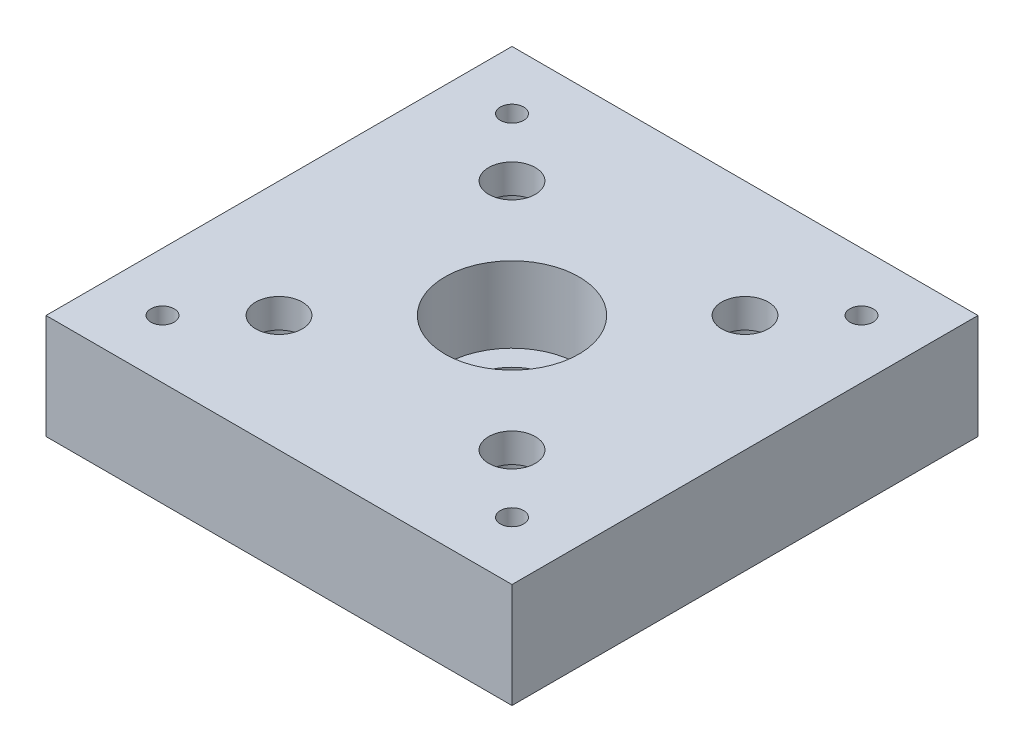
ISO-10303-21;
HEADER;
FILE_DESCRIPTION(('STEP AP214'),'2;1');
FILE_NAME('part.step','',(''),(''),'','','');
FILE_SCHEMA(('AUTOMOTIVE_DESIGN { 1 0 10303 214 1 1 1 1 }'));
ENDSEC;
DATA;
#1=APPLICATION_CONTEXT('core data for automotive mechanical design processes');
#2=APPLICATION_PROTOCOL_DEFINITION('international standard','automotive_design',2000,#1);
#3=PRODUCT_CONTEXT('',#1,'mechanical');
#4=PRODUCT('Part','Part','',(#3));
#5=PRODUCT_RELATED_PRODUCT_CATEGORY('part','',(#4));
#6=PRODUCT_DEFINITION_FORMATION('','',#4);
#7=PRODUCT_DEFINITION_CONTEXT('part definition',#1,'design');
#8=PRODUCT_DEFINITION('design','',#6,#7);
#9=PRODUCT_DEFINITION_SHAPE('','',#8);
#10=(LENGTH_UNIT() NAMED_UNIT(*) SI_UNIT(.MILLI.,.METRE.));
#11=(NAMED_UNIT(*) PLANE_ANGLE_UNIT() SI_UNIT($,.RADIAN.));
#12=(NAMED_UNIT(*) SI_UNIT($,.STERADIAN.) SOLID_ANGLE_UNIT());
#13=UNCERTAINTY_MEASURE_WITH_UNIT(LENGTH_MEASURE(1.E-05),#10,'distance_accuracy_value','');
#14=(GEOMETRIC_REPRESENTATION_CONTEXT(3) GLOBAL_UNCERTAINTY_ASSIGNED_CONTEXT((#13)) GLOBAL_UNIT_ASSIGNED_CONTEXT((#10,
#11,#12)) REPRESENTATION_CONTEXT('',''));
#15=CARTESIAN_POINT('',(0.,0.,0.));
#16=DIRECTION('',(0.,0.,1.));
#17=DIRECTION('',(1.,0.,0.));
#18=AXIS2_PLACEMENT_3D('',#15,#16,#17);
#19=CARTESIAN_POINT('',(0.,3.6,0.));
#20=DIRECTION('',(0.,-1.,0.));
#21=DIRECTION('',(0.,0.,-1.));
#22=AXIS2_PLACEMENT_3D('',#19,#20,#21);
#23=CYLINDRICAL_SURFACE('',#22,1.5);
#24=CARTESIAN_POINT('',(0.,0.,0.));
#25=DIRECTION('',(0.,1.,0.));
#26=DIRECTION('',(0.,0.,1.));
#27=AXIS2_PLACEMENT_3D('',#24,#25,#26);
#28=CIRCLE('',#27,1.5);
#29=CARTESIAN_POINT('',(0.,0.,1.5));
#30=VERTEX_POINT('',#29);
#31=EDGE_CURVE('E242',#30,#30,#28,.T.);
#32=ORIENTED_EDGE('',*,*,#31,.F.);
#33=EDGE_LOOP('',(#32));
#34=FACE_BOUND('',#33,.T.);
#35=CARTESIAN_POINT('',(0.,1.,0.));
#36=DIRECTION('',(0.,1.,0.));
#37=DIRECTION('',(0.,0.,1.));
#38=AXIS2_PLACEMENT_3D('',#35,#36,#37);
#39=CIRCLE('',#38,1.5);
#40=CARTESIAN_POINT('',(0.,1.,1.5));
#41=VERTEX_POINT('',#40);
#42=EDGE_CURVE('E251',#41,#41,#39,.T.);
#43=ORIENTED_EDGE('',*,*,#42,.T.);
#44=EDGE_LOOP('',(#43));
#45=FACE_BOUND('',#44,.T.);
#46=ADVANCED_FACE('F172',(#34,#45),#23,.F.);
#47=CARTESIAN_POINT('',(0.,3.6,0.));
#48=DIRECTION('',(0.,1.,0.));
#49=DIRECTION('',(0.,0.,1.));
#50=AXIS2_PLACEMENT_3D('',#47,#48,#49);
#51=PLANE('',#50);
#52=CARTESIAN_POINT('',(0.,3.6,0.));
#53=DIRECTION('',(0.,1.,0.));
#54=DIRECTION('',(0.,0.,1.));
#55=AXIS2_PLACEMENT_3D('',#52,#53,#54);
#56=CIRCLE('',#55,2.3);
#57=CARTESIAN_POINT('',(0.,3.6,2.3));
#58=VERTEX_POINT('',#57);
#59=EDGE_CURVE('E267',#58,#58,#56,.T.);
#60=ORIENTED_EDGE('',*,*,#59,.F.);
#61=EDGE_LOOP('',(#60));
#62=FACE_BOUND('',#61,.T.);
#63=CARTESIAN_POINT('',(-5.99999999999999,3.6,5.99999999999999));
#64=DIRECTION('',(0.,1.,0.));
#65=DIRECTION('',(0.,0.,1.));
#66=AXIS2_PLACEMENT_3D('',#63,#64,#65);
#67=CIRCLE('',#66,0.4);
#68=CARTESIAN_POINT('',(-5.99999999999999,3.6,6.4));
#69=VERTEX_POINT('',#68);
#70=EDGE_CURVE('E285',#69,#69,#67,.T.);
#71=ORIENTED_EDGE('',*,*,#70,.F.);
#72=EDGE_LOOP('',(#71));
#73=FACE_BOUND('',#72,.T.);
#74=CARTESIAN_POINT('',(-5.99999999999999,3.6,-6.00000000000001));
#75=DIRECTION('',(0.,1.,0.));
#76=DIRECTION('',(0.,0.,1.));
#77=AXIS2_PLACEMENT_3D('',#74,#75,#76);
#78=CIRCLE('',#77,0.4);
#79=CARTESIAN_POINT('',(-5.99999999999999,3.6,-5.6));
#80=VERTEX_POINT('',#79);
#81=EDGE_CURVE('E297',#80,#80,#78,.T.);
#82=ORIENTED_EDGE('',*,*,#81,.F.);
#83=EDGE_LOOP('',(#82));
#84=FACE_BOUND('',#83,.T.);
#85=CARTESIAN_POINT('',(4.,3.6,4.));
#86=DIRECTION('',(0.,1.,0.));
#87=DIRECTION('',(0.,0.,1.));
#88=AXIS2_PLACEMENT_3D('',#85,#86,#87);
#89=CIRCLE('',#88,0.8);
#90=CARTESIAN_POINT('',(4.,3.6,4.8));
#91=VERTEX_POINT('',#90);
#92=EDGE_CURVE('E305',#91,#91,#89,.T.);
#93=ORIENTED_EDGE('',*,*,#92,.F.);
#94=EDGE_LOOP('',(#93));
#95=FACE_BOUND('',#94,.T.);
#96=CARTESIAN_POINT('',(-4.,3.6,-4.));
#97=DIRECTION('',(0.,1.,0.));
#98=DIRECTION('',(0.,0.,1.));
#99=AXIS2_PLACEMENT_3D('',#96,#97,#98);
#100=CIRCLE('',#99,0.8);
#101=CARTESIAN_POINT('',(-4.,3.6,-3.2));
#102=VERTEX_POINT('',#101);
#103=EDGE_CURVE('E311',#102,#102,#100,.T.);
#104=ORIENTED_EDGE('',*,*,#103,.F.);
#105=EDGE_LOOP('',(#104));
#106=FACE_BOUND('',#105,.T.);
#107=DIRECTION('',(1.,0.,0.));
#108=VECTOR('',#107,1.);
#109=CARTESIAN_POINT('',(-7.99999999999999,3.6,7.99999999999999));
#110=LINE('',#109,#108);
#111=CARTESIAN_POINT('',(-7.99999999999999,3.6,7.99999999999999));
#112=VERTEX_POINT('',#111);
#113=CARTESIAN_POINT('',(8.00000000000001,3.6,7.99999999999999));
#114=VERTEX_POINT('',#113);
#115=EDGE_CURVE('E225',#112,#114,#110,.T.);
#116=ORIENTED_EDGE('',*,*,#115,.T.);
#117=DIRECTION('',(0.,0.,-1.));
#118=VECTOR('',#117,1.);
#119=CARTESIAN_POINT('',(8.00000000000001,3.6,7.99999999999999));
#120=LINE('',#119,#118);
#121=CARTESIAN_POINT('',(8.00000000000001,3.6,-8.00000000000001));
#122=VERTEX_POINT('',#121);
#123=EDGE_CURVE('E216',#114,#122,#120,.T.);
#124=ORIENTED_EDGE('',*,*,#123,.T.);
#125=DIRECTION('',(1.,0.,0.));
#126=VECTOR('',#125,1.);
#127=CARTESIAN_POINT('',(-7.99999999999999,3.6,-8.00000000000001));
#128=LINE('',#127,#126);
#129=CARTESIAN_POINT('',(-7.99999999999999,3.6,-8.00000000000001));
#130=VERTEX_POINT('',#129);
#131=EDGE_CURVE('E224',#130,#122,#128,.T.);
#132=ORIENTED_EDGE('',*,*,#131,.F.);
#133=DIRECTION('',(0.,0.,-1.));
#134=VECTOR('',#133,1.);
#135=CARTESIAN_POINT('',(-7.99999999999999,3.6,7.99999999999999));
#136=LINE('',#135,#134);
#137=EDGE_CURVE('E235',#112,#130,#136,.T.);
#138=ORIENTED_EDGE('',*,*,#137,.F.);
#139=EDGE_LOOP('',(#116,#124,#132,#138));
#140=FACE_BOUND('',#139,.T.);
#141=CARTESIAN_POINT('',(-4.,3.6,4.));
#142=DIRECTION('',(0.,1.,0.));
#143=DIRECTION('',(0.,0.,1.));
#144=AXIS2_PLACEMENT_3D('',#141,#142,#143);
#145=CIRCLE('',#144,0.8);
#146=CARTESIAN_POINT('',(-4.,3.6,4.8));
#147=VERTEX_POINT('',#146);
#148=EDGE_CURVE('E308',#147,#147,#145,.T.);
#149=ORIENTED_EDGE('',*,*,#148,.F.);
#150=EDGE_LOOP('',(#149));
#151=FACE_BOUND('',#150,.T.);
#152=CARTESIAN_POINT('',(4.,3.6,-4.));
#153=DIRECTION('',(0.,1.,0.));
#154=DIRECTION('',(0.,0.,1.));
#155=AXIS2_PLACEMENT_3D('',#152,#153,#154);
#156=CIRCLE('',#155,0.800000000000001);
#157=CARTESIAN_POINT('',(4.,3.6,-3.2));
#158=VERTEX_POINT('',#157);
#159=EDGE_CURVE('E300',#158,#158,#156,.T.);
#160=ORIENTED_EDGE('',*,*,#159,.F.);
#161=EDGE_LOOP('',(#160));
#162=FACE_BOUND('',#161,.T.);
#163=CARTESIAN_POINT('',(6.00000000000001,3.6,-6.00000000000001));
#164=DIRECTION('',(0.,1.,0.));
#165=DIRECTION('',(0.,0.,1.));
#166=AXIS2_PLACEMENT_3D('',#163,#164,#165);
#167=CIRCLE('',#166,0.4);
#168=CARTESIAN_POINT('',(6.00000000000001,3.6,-5.6));
#169=VERTEX_POINT('',#168);
#170=EDGE_CURVE('E291',#169,#169,#167,.T.);
#171=ORIENTED_EDGE('',*,*,#170,.F.);
#172=EDGE_LOOP('',(#171));
#173=FACE_BOUND('',#172,.T.);
#174=CARTESIAN_POINT('',(6.00000000000001,3.6,5.99999999999999));
#175=DIRECTION('',(0.,1.,0.));
#176=DIRECTION('',(0.,0.,1.));
#177=AXIS2_PLACEMENT_3D('',#174,#175,#176);
#178=CIRCLE('',#177,0.4);
#179=CARTESIAN_POINT('',(6.00000000000001,3.6,6.4));
#180=VERTEX_POINT('',#179);
#181=EDGE_CURVE('E279',#180,#180,#178,.T.);
#182=ORIENTED_EDGE('',*,*,#181,.F.);
#183=EDGE_LOOP('',(#182));
#184=FACE_BOUND('',#183,.T.);
#185=ADVANCED_FACE('F220',(#62,#73,#84,#95,#106,#140,#151,#162,#173,#184),#51,.T.);
#186=CARTESIAN_POINT('',(0.,0.,0.));
#187=DIRECTION('',(0.,1.,0.));
#188=DIRECTION('',(0.,0.,1.));
#189=AXIS2_PLACEMENT_3D('',#186,#187,#188);
#190=PLANE('',#189);
#191=CARTESIAN_POINT('',(4.,0.,-4.));
#192=DIRECTION('',(0.,1.,0.));
#193=DIRECTION('',(0.,0.,1.));
#194=AXIS2_PLACEMENT_3D('',#191,#192,#193);
#195=CIRCLE('',#194,1.);
#196=CARTESIAN_POINT('',(4.,0.,-3.));
#197=VERTEX_POINT('',#196);
#198=EDGE_CURVE('E561',#197,#197,#195,.T.);
#199=ORIENTED_EDGE('',*,*,#198,.T.);
#200=EDGE_LOOP('',(#199));
#201=FACE_BOUND('',#200,.T.);
#202=CARTESIAN_POINT('',(-4.,0.,4.));
#203=DIRECTION('',(0.,1.,0.));
#204=DIRECTION('',(0.,0.,1.));
#205=AXIS2_PLACEMENT_3D('',#202,#203,#204);
#206=CIRCLE('',#205,1.);
#207=CARTESIAN_POINT('',(-4.,0.,5.));
#208=VERTEX_POINT('',#207);
#209=EDGE_CURVE('E562',#208,#208,#206,.T.);
#210=ORIENTED_EDGE('',*,*,#209,.T.);
#211=EDGE_LOOP('',(#210));
#212=FACE_BOUND('',#211,.T.);
#213=CARTESIAN_POINT('',(-4.,0.,-4.));
#214=DIRECTION('',(0.,1.,0.));
#215=DIRECTION('',(0.,0.,1.));
#216=AXIS2_PLACEMENT_3D('',#213,#214,#215);
#217=CIRCLE('',#216,1.);
#218=CARTESIAN_POINT('',(-4.,0.,-3.));
#219=VERTEX_POINT('',#218);
#220=EDGE_CURVE('E552',#219,#219,#217,.T.);
#221=ORIENTED_EDGE('',*,*,#220,.T.);
#222=EDGE_LOOP('',(#221));
#223=FACE_BOUND('',#222,.T.);
#224=CARTESIAN_POINT('',(4.,0.,4.));
#225=DIRECTION('',(0.,1.,0.));
#226=DIRECTION('',(0.,0.,1.));
#227=AXIS2_PLACEMENT_3D('',#224,#225,#226);
#228=CIRCLE('',#227,1.);
#229=CARTESIAN_POINT('',(4.,0.,5.));
#230=VERTEX_POINT('',#229);
#231=EDGE_CURVE('E565',#230,#230,#228,.T.);
#232=ORIENTED_EDGE('',*,*,#231,.T.);
#233=EDGE_LOOP('',(#232));
#234=FACE_BOUND('',#233,.T.);
#235=DIRECTION('',(1.,0.,0.));
#236=VECTOR('',#235,1.);
#237=CARTESIAN_POINT('',(-7.99999999999999,0.,7.99999999999999));
#238=LINE('',#237,#236);
#239=CARTESIAN_POINT('',(-7.99999999999999,0.,7.99999999999999));
#240=VERTEX_POINT('',#239);
#241=CARTESIAN_POINT('',(8.00000000000001,0.,7.99999999999999));
#242=VERTEX_POINT('',#241);
#243=EDGE_CURVE('E240',#240,#242,#238,.T.);
#244=ORIENTED_EDGE('',*,*,#243,.F.);
#245=DIRECTION('',(0.,0.,-1.));
#246=VECTOR('',#245,1.);
#247=CARTESIAN_POINT('',(-7.99999999999999,0.,7.99999999999999));
#248=LINE('',#247,#246);
#249=CARTESIAN_POINT('',(-7.99999999999999,0.,-8.00000000000001));
#250=VERTEX_POINT('',#249);
#251=EDGE_CURVE('E246',#240,#250,#248,.T.);
#252=ORIENTED_EDGE('',*,*,#251,.T.);
#253=DIRECTION('',(1.,0.,0.));
#254=VECTOR('',#253,1.);
#255=CARTESIAN_POINT('',(-7.99999999999999,0.,-8.00000000000001));
#256=LINE('',#255,#254);
#257=CARTESIAN_POINT('',(8.00000000000001,0.,-8.00000000000001));
#258=VERTEX_POINT('',#257);
#259=EDGE_CURVE('E244',#250,#258,#256,.T.);
#260=ORIENTED_EDGE('',*,*,#259,.T.);
#261=DIRECTION('',(0.,0.,-1.));
#262=VECTOR('',#261,1.);
#263=CARTESIAN_POINT('',(8.00000000000001,0.,7.99999999999999));
#264=LINE('',#263,#262);
#265=EDGE_CURVE('E230',#242,#258,#264,.T.);
#266=ORIENTED_EDGE('',*,*,#265,.F.);
#267=EDGE_LOOP('',(#244,#252,#260,#266));
#268=FACE_BOUND('',#267,.T.);
#269=ORIENTED_EDGE('',*,*,#31,.T.);
#270=EDGE_LOOP('',(#269));
#271=FACE_BOUND('',#270,.T.);
#272=CARTESIAN_POINT('',(-5.99999999999999,0.,-6.00000000000001));
#273=DIRECTION('',(0.,1.,0.));
#274=DIRECTION('',(0.,0.,1.));
#275=AXIS2_PLACEMENT_3D('',#272,#273,#274);
#276=CIRCLE('',#275,0.4);
#277=CARTESIAN_POINT('',(-5.99999999999999,0.,-5.6));
#278=VERTEX_POINT('',#277);
#279=EDGE_CURVE('E294',#278,#278,#276,.T.);
#280=ORIENTED_EDGE('',*,*,#279,.T.);
#281=EDGE_LOOP('',(#280));
#282=FACE_BOUND('',#281,.T.);
#283=CARTESIAN_POINT('',(6.00000000000001,0.,-6.00000000000001));
#284=DIRECTION('',(0.,1.,0.));
#285=DIRECTION('',(0.,0.,1.));
#286=AXIS2_PLACEMENT_3D('',#283,#284,#285);
#287=CIRCLE('',#286,0.4);
#288=CARTESIAN_POINT('',(6.00000000000001,0.,-5.6));
#289=VERTEX_POINT('',#288);
#290=EDGE_CURVE('E288',#289,#289,#287,.T.);
#291=ORIENTED_EDGE('',*,*,#290,.T.);
#292=EDGE_LOOP('',(#291));
#293=FACE_BOUND('',#292,.T.);
#294=CARTESIAN_POINT('',(-5.99999999999999,0.,5.99999999999999));
#295=DIRECTION('',(0.,1.,0.));
#296=DIRECTION('',(0.,0.,1.));
#297=AXIS2_PLACEMENT_3D('',#294,#295,#296);
#298=CIRCLE('',#297,0.4);
#299=CARTESIAN_POINT('',(-5.99999999999999,0.,6.4));
#300=VERTEX_POINT('',#299);
#301=EDGE_CURVE('E282',#300,#300,#298,.T.);
#302=ORIENTED_EDGE('',*,*,#301,.T.);
#303=EDGE_LOOP('',(#302));
#304=FACE_BOUND('',#303,.T.);
#305=CARTESIAN_POINT('',(6.00000000000001,0.,5.99999999999999));
#306=DIRECTION('',(0.,1.,0.));
#307=DIRECTION('',(0.,0.,1.));
#308=AXIS2_PLACEMENT_3D('',#305,#306,#307);
#309=CIRCLE('',#308,0.4);
#310=CARTESIAN_POINT('',(6.00000000000001,0.,6.4));
#311=VERTEX_POINT('',#310);
#312=EDGE_CURVE('E254',#311,#311,#309,.T.);
#313=ORIENTED_EDGE('',*,*,#312,.T.);
#314=EDGE_LOOP('',(#313));
#315=FACE_BOUND('',#314,.T.);
#316=ADVANCED_FACE('F317',(#201,#212,#223,#234,#268,#271,#282,#293,#304,#315),#190,.F.);
#317=CARTESIAN_POINT('',(-7.99999999999999,3.6,7.99999999999999));
#318=DIRECTION('',(0.,0.,-1.));
#319=DIRECTION('',(-1.,0.,0.));
#320=AXIS2_PLACEMENT_3D('',#317,#318,#319);
#321=PLANE('',#320);
#322=ORIENTED_EDGE('',*,*,#243,.T.);
#323=DIRECTION('',(0.,-1.,0.));
#324=VECTOR('',#323,1.);
#325=CARTESIAN_POINT('',(8.00000000000001,3.6,7.99999999999999));
#326=LINE('',#325,#324);
#327=EDGE_CURVE('E13',#114,#242,#326,.T.);
#328=ORIENTED_EDGE('',*,*,#327,.F.);
#329=ORIENTED_EDGE('',*,*,#115,.F.);
#330=DIRECTION('',(0.,-1.,0.));
#331=VECTOR('',#330,1.);
#332=CARTESIAN_POINT('',(-7.99999999999999,3.6,7.99999999999999));
#333=LINE('',#332,#331);
#334=EDGE_CURVE('E191',#112,#240,#333,.T.);
#335=ORIENTED_EDGE('',*,*,#334,.T.);
#336=EDGE_LOOP('',(#322,#328,#329,#335));
#337=FACE_BOUND('',#336,.T.);
#338=ADVANCED_FACE('F174',(#337),#321,.F.);
#339=CARTESIAN_POINT('',(8.00000000000001,3.6,7.99999999999999));
#340=DIRECTION('',(-1.,0.,0.));
#341=DIRECTION('',(0.,0.,1.));
#342=AXIS2_PLACEMENT_3D('',#339,#340,#341);
#343=PLANE('',#342);
#344=ORIENTED_EDGE('',*,*,#265,.T.);
#345=DIRECTION('',(0.,-1.,0.));
#346=VECTOR('',#345,1.);
#347=CARTESIAN_POINT('',(8.00000000000001,3.6,-8.00000000000001));
#348=LINE('',#347,#346);
#349=EDGE_CURVE('E182',#122,#258,#348,.T.);
#350=ORIENTED_EDGE('',*,*,#349,.F.);
#351=ORIENTED_EDGE('',*,*,#123,.F.);
#352=ORIENTED_EDGE('',*,*,#327,.T.);
#353=EDGE_LOOP('',(#344,#350,#351,#352));
#354=FACE_BOUND('',#353,.T.);
#355=ADVANCED_FACE('F229',(#354),#343,.F.);
#356=CARTESIAN_POINT('',(-7.99999999999999,3.6,-8.00000000000001));
#357=DIRECTION('',(0.,0.,-1.));
#358=DIRECTION('',(-1.,0.,0.));
#359=AXIS2_PLACEMENT_3D('',#356,#357,#358);
#360=PLANE('',#359);
#361=ORIENTED_EDGE('',*,*,#259,.F.);
#362=DIRECTION('',(0.,-1.,0.));
#363=VECTOR('',#362,1.);
#364=CARTESIAN_POINT('',(-7.99999999999999,3.6,-8.00000000000001));
#365=LINE('',#364,#363);
#366=EDGE_CURVE('E205',#130,#250,#365,.T.);
#367=ORIENTED_EDGE('',*,*,#366,.F.);
#368=ORIENTED_EDGE('',*,*,#131,.T.);
#369=ORIENTED_EDGE('',*,*,#349,.T.);
#370=EDGE_LOOP('',(#361,#367,#368,#369));
#371=FACE_BOUND('',#370,.T.);
#372=ADVANCED_FACE('F234',(#371),#360,.T.);
#373=CARTESIAN_POINT('',(-7.99999999999999,3.6,7.99999999999999));
#374=DIRECTION('',(-1.,0.,0.));
#375=DIRECTION('',(0.,0.,1.));
#376=AXIS2_PLACEMENT_3D('',#373,#374,#375);
#377=PLANE('',#376);
#378=ORIENTED_EDGE('',*,*,#251,.F.);
#379=ORIENTED_EDGE('',*,*,#334,.F.);
#380=ORIENTED_EDGE('',*,*,#137,.T.);
#381=ORIENTED_EDGE('',*,*,#366,.T.);
#382=EDGE_LOOP('',(#378,#379,#380,#381));
#383=FACE_BOUND('',#382,.T.);
#384=ADVANCED_FACE('F369',(#383),#377,.T.);
#385=CARTESIAN_POINT('',(-4.,3.6,-4.));
#386=DIRECTION('',(0.,-1.,0.));
#387=DIRECTION('',(0.,0.,-1.));
#388=AXIS2_PLACEMENT_3D('',#385,#386,#387);
#389=CYLINDRICAL_SURFACE('',#388,0.8);
#390=CARTESIAN_POINT('',(-4.,2.6,-4.));
#391=DIRECTION('',(0.,1.,0.));
#392=DIRECTION('',(0.,0.,1.));
#393=AXIS2_PLACEMENT_3D('',#390,#391,#392);
#394=CIRCLE('',#393,0.8);
#395=CARTESIAN_POINT('',(-4.,2.6,-3.2));
#396=VERTEX_POINT('',#395);
#397=EDGE_CURVE('E176',#396,#396,#394,.T.);
#398=ORIENTED_EDGE('',*,*,#397,.F.);
#399=EDGE_LOOP('',(#398));
#400=FACE_BOUND('',#399,.T.);
#401=ORIENTED_EDGE('',*,*,#103,.T.);
#402=EDGE_LOOP('',(#401));
#403=FACE_BOUND('',#402,.T.);
#404=ADVANCED_FACE('F366',(#400,#403),#389,.F.);
#405=CARTESIAN_POINT('',(-4.,3.6,4.));
#406=DIRECTION('',(0.,-1.,0.));
#407=DIRECTION('',(0.,0.,-1.));
#408=AXIS2_PLACEMENT_3D('',#405,#406,#407);
#409=CYLINDRICAL_SURFACE('',#408,0.8);
#410=CARTESIAN_POINT('',(-4.,2.6,4.));
#411=DIRECTION('',(0.,1.,0.));
#412=DIRECTION('',(0.,0.,1.));
#413=AXIS2_PLACEMENT_3D('',#410,#411,#412);
#414=CIRCLE('',#413,0.8);
#415=CARTESIAN_POINT('',(-4.,2.6,4.8));
#416=VERTEX_POINT('',#415);
#417=EDGE_CURVE('E262',#416,#416,#414,.T.);
#418=ORIENTED_EDGE('',*,*,#417,.F.);
#419=EDGE_LOOP('',(#418));
#420=FACE_BOUND('',#419,.T.);
#421=ORIENTED_EDGE('',*,*,#148,.T.);
#422=EDGE_LOOP('',(#421));
#423=FACE_BOUND('',#422,.T.);
#424=ADVANCED_FACE('F362',(#420,#423),#409,.F.);
#425=CARTESIAN_POINT('',(4.,3.6,4.));
#426=DIRECTION('',(0.,-1.,0.));
#427=DIRECTION('',(0.,0.,-1.));
#428=AXIS2_PLACEMENT_3D('',#425,#426,#427);
#429=CYLINDRICAL_SURFACE('',#428,0.8);
#430=CARTESIAN_POINT('',(4.,2.6,4.));
#431=DIRECTION('',(0.,1.,0.));
#432=DIRECTION('',(0.,0.,1.));
#433=AXIS2_PLACEMENT_3D('',#430,#431,#432);
#434=CIRCLE('',#433,0.8);
#435=CARTESIAN_POINT('',(4.,2.6,4.8));
#436=VERTEX_POINT('',#435);
#437=EDGE_CURVE('E259',#436,#436,#434,.T.);
#438=ORIENTED_EDGE('',*,*,#437,.F.);
#439=EDGE_LOOP('',(#438));
#440=FACE_BOUND('',#439,.T.);
#441=ORIENTED_EDGE('',*,*,#92,.T.);
#442=EDGE_LOOP('',(#441));
#443=FACE_BOUND('',#442,.T.);
#444=ADVANCED_FACE('F358',(#440,#443),#429,.F.);
#445=CARTESIAN_POINT('',(4.,3.6,-4.));
#446=DIRECTION('',(0.,-1.,0.));
#447=DIRECTION('',(0.,0.,-1.));
#448=AXIS2_PLACEMENT_3D('',#445,#446,#447);
#449=CYLINDRICAL_SURFACE('',#448,0.800000000000001);
#450=CARTESIAN_POINT('',(4.,2.6,-4.));
#451=DIRECTION('',(0.,1.,0.));
#452=DIRECTION('',(0.,0.,1.));
#453=AXIS2_PLACEMENT_3D('',#450,#451,#452);
#454=CIRCLE('',#453,0.800000000000001);
#455=CARTESIAN_POINT('',(4.,2.6,-3.2));
#456=VERTEX_POINT('',#455);
#457=EDGE_CURVE('E256',#456,#456,#454,.T.);
#458=ORIENTED_EDGE('',*,*,#457,.F.);
#459=EDGE_LOOP('',(#458));
#460=FACE_BOUND('',#459,.T.);
#461=ORIENTED_EDGE('',*,*,#159,.T.);
#462=EDGE_LOOP('',(#461));
#463=FACE_BOUND('',#462,.T.);
#464=ADVANCED_FACE('F354',(#460,#463),#449,.F.);
#465=CARTESIAN_POINT('',(-5.99999999999999,3.6,-6.00000000000001));
#466=DIRECTION('',(0.,-1.,0.));
#467=DIRECTION('',(0.,0.,-1.));
#468=AXIS2_PLACEMENT_3D('',#465,#466,#467);
#469=CYLINDRICAL_SURFACE('',#468,0.4);
#470=ORIENTED_EDGE('',*,*,#81,.T.);
#471=EDGE_LOOP('',(#470));
#472=FACE_BOUND('',#471,.T.);
#473=ORIENTED_EDGE('',*,*,#279,.F.);
#474=EDGE_LOOP('',(#473));
#475=FACE_BOUND('',#474,.T.);
#476=ADVANCED_FACE('F350',(#472,#475),#469,.F.);
#477=CARTESIAN_POINT('',(6.00000000000001,3.6,-6.00000000000001));
#478=DIRECTION('',(0.,-1.,0.));
#479=DIRECTION('',(0.,0.,-1.));
#480=AXIS2_PLACEMENT_3D('',#477,#478,#479);
#481=CYLINDRICAL_SURFACE('',#480,0.4);
#482=ORIENTED_EDGE('',*,*,#170,.T.);
#483=EDGE_LOOP('',(#482));
#484=FACE_BOUND('',#483,.T.);
#485=ORIENTED_EDGE('',*,*,#290,.F.);
#486=EDGE_LOOP('',(#485));
#487=FACE_BOUND('',#486,.T.);
#488=ADVANCED_FACE('F346',(#484,#487),#481,.F.);
#489=CARTESIAN_POINT('',(-5.99999999999999,3.6,5.99999999999999));
#490=DIRECTION('',(0.,-1.,0.));
#491=DIRECTION('',(0.,0.,-1.));
#492=AXIS2_PLACEMENT_3D('',#489,#490,#491);
#493=CYLINDRICAL_SURFACE('',#492,0.4);
#494=ORIENTED_EDGE('',*,*,#70,.T.);
#495=EDGE_LOOP('',(#494));
#496=FACE_BOUND('',#495,.T.);
#497=ORIENTED_EDGE('',*,*,#301,.F.);
#498=EDGE_LOOP('',(#497));
#499=FACE_BOUND('',#498,.T.);
#500=ADVANCED_FACE('F339',(#496,#499),#493,.F.);
#501=CARTESIAN_POINT('',(6.00000000000001,3.6,5.99999999999999));
#502=DIRECTION('',(0.,-1.,0.));
#503=DIRECTION('',(0.,0.,-1.));
#504=AXIS2_PLACEMENT_3D('',#501,#502,#503);
#505=CYLINDRICAL_SURFACE('',#504,0.4);
#506=ORIENTED_EDGE('',*,*,#181,.T.);
#507=EDGE_LOOP('',(#506));
#508=FACE_BOUND('',#507,.T.);
#509=ORIENTED_EDGE('',*,*,#312,.F.);
#510=EDGE_LOOP('',(#509));
#511=FACE_BOUND('',#510,.T.);
#512=ADVANCED_FACE('F334',(#508,#511),#505,.F.);
#513=CARTESIAN_POINT('',(0.,-6.50538238691624,0.));
#514=DIRECTION('',(0.,1.,0.));
#515=DIRECTION('',(0.,0.,1.));
#516=AXIS2_PLACEMENT_3D('',#513,#514,#515);
#517=CYLINDRICAL_SURFACE('',#516,2.3);
#518=CARTESIAN_POINT('',(0.,1.,0.));
#519=DIRECTION('',(0.,1.,0.));
#520=DIRECTION('',(0.,0.,1.));
#521=AXIS2_PLACEMENT_3D('',#518,#519,#520);
#522=CIRCLE('',#521,2.3);
#523=CARTESIAN_POINT('',(0.,1.,2.3));
#524=VERTEX_POINT('',#523);
#525=EDGE_CURVE('E255',#524,#524,#522,.F.);
#526=ORIENTED_EDGE('',*,*,#525,.T.);
#527=EDGE_LOOP('',(#526));
#528=FACE_BOUND('',#527,.T.);
#529=ORIENTED_EDGE('',*,*,#59,.T.);
#530=EDGE_LOOP('',(#529));
#531=FACE_BOUND('',#530,.T.);
#532=ADVANCED_FACE('F329',(#528,#531),#517,.F.);
#533=CARTESIAN_POINT('',(0.,1.,0.));
#534=DIRECTION('',(0.,1.,0.));
#535=DIRECTION('',(0.,0.,1.));
#536=AXIS2_PLACEMENT_3D('',#533,#534,#535);
#537=PLANE('',#536);
#538=ORIENTED_EDGE('',*,*,#42,.F.);
#539=EDGE_LOOP('',(#538));
#540=FACE_BOUND('',#539,.T.);
#541=ORIENTED_EDGE('',*,*,#525,.F.);
#542=EDGE_LOOP('',(#541));
#543=FACE_BOUND('',#542,.T.);
#544=ADVANCED_FACE('F325',(#540,#543),#537,.T.);
#545=CARTESIAN_POINT('',(4.,6.42842712474619,-4.));
#546=DIRECTION('',(0.,-1.,0.));
#547=DIRECTION('',(0.,0.,-1.));
#548=AXIS2_PLACEMENT_3D('',#545,#546,#547);
#549=CYLINDRICAL_SURFACE('',#548,1.);
#550=ORIENTED_EDGE('',*,*,#198,.F.);
#551=EDGE_LOOP('',(#550));
#552=FACE_BOUND('',#551,.T.);
#553=CARTESIAN_POINT('',(4.,2.6,-4.));
#554=DIRECTION('',(0.,1.,0.));
#555=DIRECTION('',(0.,0.,1.));
#556=AXIS2_PLACEMENT_3D('',#553,#554,#555);
#557=CIRCLE('',#556,1.);
#558=CARTESIAN_POINT('',(4.,2.6,-3.));
#559=VERTEX_POINT('',#558);
#560=EDGE_CURVE('E558',#559,#559,#557,.T.);
#561=ORIENTED_EDGE('',*,*,#560,.T.);
#562=EDGE_LOOP('',(#561));
#563=FACE_BOUND('',#562,.T.);
#564=ADVANCED_FACE('F328',(#552,#563),#549,.F.);
#565=CARTESIAN_POINT('',(0.,2.6,0.));
#566=DIRECTION('',(0.,1.,0.));
#567=DIRECTION('',(0.,0.,1.));
#568=AXIS2_PLACEMENT_3D('',#565,#566,#567);
#569=PLANE('',#568);
#570=ORIENTED_EDGE('',*,*,#457,.T.);
#571=EDGE_LOOP('',(#570));
#572=FACE_BOUND('',#571,.T.);
#573=ORIENTED_EDGE('',*,*,#560,.F.);
#574=EDGE_LOOP('',(#573));
#575=FACE_BOUND('',#574,.T.);
#576=ADVANCED_FACE('F475',(#572,#575),#569,.F.);
#577=CARTESIAN_POINT('',(4.,6.42842712474619,4.));
#578=DIRECTION('',(0.,-1.,0.));
#579=DIRECTION('',(0.,0.,-1.));
#580=AXIS2_PLACEMENT_3D('',#577,#578,#579);
#581=CYLINDRICAL_SURFACE('',#580,1.);
#582=ORIENTED_EDGE('',*,*,#231,.F.);
#583=EDGE_LOOP('',(#582));
#584=FACE_BOUND('',#583,.T.);
#585=CARTESIAN_POINT('',(4.,2.6,4.));
#586=DIRECTION('',(0.,1.,0.));
#587=DIRECTION('',(0.,0.,1.));
#588=AXIS2_PLACEMENT_3D('',#585,#586,#587);
#589=CIRCLE('',#588,1.);
#590=CARTESIAN_POINT('',(4.,2.6,5.));
#591=VERTEX_POINT('',#590);
#592=EDGE_CURVE('E260',#591,#591,#589,.T.);
#593=ORIENTED_EDGE('',*,*,#592,.T.);
#594=EDGE_LOOP('',(#593));
#595=FACE_BOUND('',#594,.T.);
#596=ADVANCED_FACE('F486',(#584,#595),#581,.F.);
#597=CARTESIAN_POINT('',(0.,2.6,0.));
#598=DIRECTION('',(0.,1.,0.));
#599=DIRECTION('',(0.,0.,1.));
#600=AXIS2_PLACEMENT_3D('',#597,#598,#599);
#601=PLANE('',#600);
#602=ORIENTED_EDGE('',*,*,#437,.T.);
#603=EDGE_LOOP('',(#602));
#604=FACE_BOUND('',#603,.T.);
#605=ORIENTED_EDGE('',*,*,#592,.F.);
#606=EDGE_LOOP('',(#605));
#607=FACE_BOUND('',#606,.T.);
#608=ADVANCED_FACE('F496',(#604,#607),#601,.F.);
#609=CARTESIAN_POINT('',(-4.,6.42842712474619,4.));
#610=DIRECTION('',(0.,-1.,0.));
#611=DIRECTION('',(0.,0.,-1.));
#612=AXIS2_PLACEMENT_3D('',#609,#610,#611);
#613=CYLINDRICAL_SURFACE('',#612,1.);
#614=ORIENTED_EDGE('',*,*,#209,.F.);
#615=EDGE_LOOP('',(#614));
#616=FACE_BOUND('',#615,.T.);
#617=CARTESIAN_POINT('',(-4.,2.6,4.));
#618=DIRECTION('',(0.,1.,0.));
#619=DIRECTION('',(0.,0.,1.));
#620=AXIS2_PLACEMENT_3D('',#617,#618,#619);
#621=CIRCLE('',#620,1.);
#622=CARTESIAN_POINT('',(-4.,2.6,5.));
#623=VERTEX_POINT('',#622);
#624=EDGE_CURVE('E555',#623,#623,#621,.T.);
#625=ORIENTED_EDGE('',*,*,#624,.T.);
#626=EDGE_LOOP('',(#625));
#627=FACE_BOUND('',#626,.T.);
#628=ADVANCED_FACE('F506',(#616,#627),#613,.F.);
#629=CARTESIAN_POINT('',(0.,2.6,0.));
#630=DIRECTION('',(0.,1.,0.));
#631=DIRECTION('',(0.,0.,1.));
#632=AXIS2_PLACEMENT_3D('',#629,#630,#631);
#633=PLANE('',#632);
#634=ORIENTED_EDGE('',*,*,#417,.T.);
#635=EDGE_LOOP('',(#634));
#636=FACE_BOUND('',#635,.T.);
#637=ORIENTED_EDGE('',*,*,#624,.F.);
#638=EDGE_LOOP('',(#637));
#639=FACE_BOUND('',#638,.T.);
#640=ADVANCED_FACE('F515',(#636,#639),#633,.F.);
#641=CARTESIAN_POINT('',(-4.,6.42842712474619,-4.));
#642=DIRECTION('',(0.,-1.,0.));
#643=DIRECTION('',(0.,0.,-1.));
#644=AXIS2_PLACEMENT_3D('',#641,#642,#643);
#645=CYLINDRICAL_SURFACE('',#644,1.);
#646=ORIENTED_EDGE('',*,*,#220,.F.);
#647=EDGE_LOOP('',(#646));
#648=FACE_BOUND('',#647,.T.);
#649=CARTESIAN_POINT('',(-4.,2.6,-4.));
#650=DIRECTION('',(0.,1.,0.));
#651=DIRECTION('',(0.,0.,1.));
#652=AXIS2_PLACEMENT_3D('',#649,#650,#651);
#653=CIRCLE('',#652,1.);
#654=CARTESIAN_POINT('',(-4.,2.6,-3.));
#655=VERTEX_POINT('',#654);
#656=EDGE_CURVE('E550',#655,#655,#653,.T.);
#657=ORIENTED_EDGE('',*,*,#656,.T.);
#658=EDGE_LOOP('',(#657));
#659=FACE_BOUND('',#658,.T.);
#660=ADVANCED_FACE('F525',(#648,#659),#645,.F.);
#661=CARTESIAN_POINT('',(0.,2.6,0.));
#662=DIRECTION('',(0.,1.,0.));
#663=DIRECTION('',(0.,0.,1.));
#664=AXIS2_PLACEMENT_3D('',#661,#662,#663);
#665=PLANE('',#664);
#666=ORIENTED_EDGE('',*,*,#397,.T.);
#667=EDGE_LOOP('',(#666));
#668=FACE_BOUND('',#667,.T.);
#669=ORIENTED_EDGE('',*,*,#656,.F.);
#670=EDGE_LOOP('',(#669));
#671=FACE_BOUND('',#670,.T.);
#672=ADVANCED_FACE('F534',(#668,#671),#665,.F.);
#673=CLOSED_SHELL('',(#46,#185,#316,#338,#355,#372,#384,#404,#424,#444,#464,#476,#488,#500,#512,
#532,#544,#564,#576,#596,#608,#628,#640,#660,#672));
#674=MANIFOLD_SOLID_BREP('B2',#673);
#675=ADVANCED_BREP_SHAPE_REPRESENTATION('',(#18,#674),#14);
#676=SHAPE_DEFINITION_REPRESENTATION(#9,#675);
ENDSEC;
END-ISO-10303-21;
